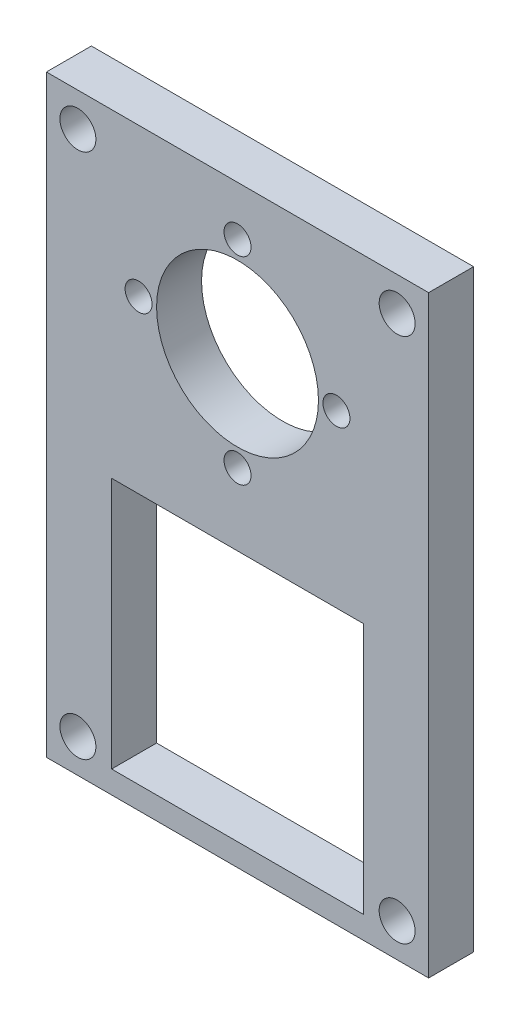
ISO-10303-21;
HEADER;
FILE_DESCRIPTION(('STEP AP214'),'2;1');
FILE_NAME('part.step','',(''),(''),'','','');
FILE_SCHEMA(('AUTOMOTIVE_DESIGN { 1 0 10303 214 1 1 1 1 }'));
ENDSEC;
DATA;
#1=APPLICATION_CONTEXT('core data for automotive mechanical design processes');
#2=APPLICATION_PROTOCOL_DEFINITION('international standard','automotive_design',2000,#1);
#3=PRODUCT_CONTEXT('',#1,'mechanical');
#4=PRODUCT('Part','Part','',(#3));
#5=PRODUCT_RELATED_PRODUCT_CATEGORY('part','',(#4));
#6=PRODUCT_DEFINITION_FORMATION('','',#4);
#7=PRODUCT_DEFINITION_CONTEXT('part definition',#1,'design');
#8=PRODUCT_DEFINITION('design','',#6,#7);
#9=PRODUCT_DEFINITION_SHAPE('','',#8);
#10=(LENGTH_UNIT() NAMED_UNIT(*) SI_UNIT(.MILLI.,.METRE.));
#11=(NAMED_UNIT(*) PLANE_ANGLE_UNIT() SI_UNIT($,.RADIAN.));
#12=(NAMED_UNIT(*) SI_UNIT($,.STERADIAN.) SOLID_ANGLE_UNIT());
#13=UNCERTAINTY_MEASURE_WITH_UNIT(LENGTH_MEASURE(1.E-05),#10,'distance_accuracy_value','');
#14=(GEOMETRIC_REPRESENTATION_CONTEXT(3) GLOBAL_UNCERTAINTY_ASSIGNED_CONTEXT((#13)) GLOBAL_UNIT_ASSIGNED_CONTEXT((#10,
#11,#12)) REPRESENTATION_CONTEXT('',''));
#15=CARTESIAN_POINT('',(0.,0.,0.));
#16=DIRECTION('',(0.,0.,1.));
#17=DIRECTION('',(1.,0.,0.));
#18=AXIS2_PLACEMENT_3D('',#15,#16,#17);
#19=CARTESIAN_POINT('',(21.25,33.,5.));
#20=DIRECTION('',(-1.,0.,0.));
#21=DIRECTION('',(0.,-1.,0.));
#22=AXIS2_PLACEMENT_3D('',#19,#20,#21);
#23=PLANE('',#22);
#24=DIRECTION('',(0.,1.,0.));
#25=VECTOR('',#24,1.);
#26=CARTESIAN_POINT('',(21.25,33.,0.));
#27=LINE('',#26,#25);
#28=CARTESIAN_POINT('',(21.25,-33.,0.));
#29=VERTEX_POINT('',#28);
#30=CARTESIAN_POINT('',(21.25,33.,0.));
#31=VERTEX_POINT('',#30);
#32=EDGE_CURVE('E169',#29,#31,#27,.T.);
#33=ORIENTED_EDGE('',*,*,#32,.T.);
#34=DIRECTION('',(0.,0.,-1.));
#35=VECTOR('',#34,1.);
#36=CARTESIAN_POINT('',(21.25,33.,5.));
#37=LINE('',#36,#35);
#38=CARTESIAN_POINT('',(21.25,33.,5.));
#39=VERTEX_POINT('',#38);
#40=EDGE_CURVE('E11',#39,#31,#37,.T.);
#41=ORIENTED_EDGE('',*,*,#40,.F.);
#42=DIRECTION('',(0.,1.,0.));
#43=VECTOR('',#42,1.);
#44=CARTESIAN_POINT('',(21.25,33.,5.));
#45=LINE('',#44,#43);
#46=CARTESIAN_POINT('',(21.25,-33.,5.));
#47=VERTEX_POINT('',#46);
#48=EDGE_CURVE('E172',#47,#39,#45,.T.);
#49=ORIENTED_EDGE('',*,*,#48,.F.);
#50=DIRECTION('',(0.,0.,-1.));
#51=VECTOR('',#50,1.);
#52=CARTESIAN_POINT('',(21.25,-33.,5.));
#53=LINE('',#52,#51);
#54=EDGE_CURVE('E182',#47,#29,#53,.T.);
#55=ORIENTED_EDGE('',*,*,#54,.T.);
#56=EDGE_LOOP('',(#33,#41,#49,#55));
#57=FACE_BOUND('',#56,.T.);
#58=ADVANCED_FACE('F37',(#57),#23,.F.);
#59=CARTESIAN_POINT('',(-21.25,33.,5.));
#60=DIRECTION('',(0.,-1.,0.));
#61=DIRECTION('',(0.,0.,-1.));
#62=AXIS2_PLACEMENT_3D('',#59,#60,#61);
#63=PLANE('',#62);
#64=DIRECTION('',(-1.,0.,0.));
#65=VECTOR('',#64,1.);
#66=CARTESIAN_POINT('',(-21.25,33.,0.));
#67=LINE('',#66,#65);
#68=CARTESIAN_POINT('',(-21.25,33.,0.));
#69=VERTEX_POINT('',#68);
#70=EDGE_CURVE('E185',#31,#69,#67,.T.);
#71=ORIENTED_EDGE('',*,*,#70,.T.);
#72=DIRECTION('',(0.,0.,-1.));
#73=VECTOR('',#72,1.);
#74=CARTESIAN_POINT('',(-21.25,33.,5.));
#75=LINE('',#74,#73);
#76=CARTESIAN_POINT('',(-21.25,33.,5.));
#77=VERTEX_POINT('',#76);
#78=EDGE_CURVE('E44',#77,#69,#75,.T.);
#79=ORIENTED_EDGE('',*,*,#78,.F.);
#80=DIRECTION('',(-1.,0.,0.));
#81=VECTOR('',#80,1.);
#82=CARTESIAN_POINT('',(-21.25,33.,5.));
#83=LINE('',#82,#81);
#84=EDGE_CURVE('E175',#39,#77,#83,.T.);
#85=ORIENTED_EDGE('',*,*,#84,.F.);
#86=ORIENTED_EDGE('',*,*,#40,.T.);
#87=EDGE_LOOP('',(#71,#79,#85,#86));
#88=FACE_BOUND('',#87,.T.);
#89=ADVANCED_FACE('F214',(#88),#63,.F.);
#90=CARTESIAN_POINT('',(-21.25,33.,5.));
#91=DIRECTION('',(1.,0.,0.));
#92=DIRECTION('',(0.,1.,0.));
#93=AXIS2_PLACEMENT_3D('',#90,#91,#92);
#94=PLANE('',#93);
#95=DIRECTION('',(0.,-1.,0.));
#96=VECTOR('',#95,1.);
#97=CARTESIAN_POINT('',(-21.25,33.,0.));
#98=LINE('',#97,#96);
#99=CARTESIAN_POINT('',(-21.25,-33.,0.));
#100=VERTEX_POINT('',#99);
#101=EDGE_CURVE('E187',#69,#100,#98,.T.);
#102=ORIENTED_EDGE('',*,*,#101,.T.);
#103=DIRECTION('',(0.,0.,-1.));
#104=VECTOR('',#103,1.);
#105=CARTESIAN_POINT('',(-21.25,-33.,5.));
#106=LINE('',#105,#104);
#107=CARTESIAN_POINT('',(-21.25,-33.,5.));
#108=VERTEX_POINT('',#107);
#109=EDGE_CURVE('E192',#108,#100,#106,.T.);
#110=ORIENTED_EDGE('',*,*,#109,.F.);
#111=DIRECTION('',(0.,-1.,0.));
#112=VECTOR('',#111,1.);
#113=CARTESIAN_POINT('',(-21.25,33.,5.));
#114=LINE('',#113,#112);
#115=EDGE_CURVE('E178',#77,#108,#114,.T.);
#116=ORIENTED_EDGE('',*,*,#115,.F.);
#117=ORIENTED_EDGE('',*,*,#78,.T.);
#118=EDGE_LOOP('',(#102,#110,#116,#117));
#119=FACE_BOUND('',#118,.T.);
#120=ADVANCED_FACE('F199',(#119),#94,.F.);
#121=CARTESIAN_POINT('',(-21.25,-33.,5.));
#122=DIRECTION('',(0.,1.,0.));
#123=DIRECTION('',(0.,0.,1.));
#124=AXIS2_PLACEMENT_3D('',#121,#122,#123);
#125=PLANE('',#124);
#126=DIRECTION('',(1.,0.,0.));
#127=VECTOR('',#126,1.);
#128=CARTESIAN_POINT('',(-21.25,-33.,0.));
#129=LINE('',#128,#127);
#130=EDGE_CURVE('E176',#100,#29,#129,.T.);
#131=ORIENTED_EDGE('',*,*,#130,.T.);
#132=ORIENTED_EDGE('',*,*,#54,.F.);
#133=DIRECTION('',(1.,0.,0.));
#134=VECTOR('',#133,1.);
#135=CARTESIAN_POINT('',(-21.25,-33.,5.));
#136=LINE('',#135,#134);
#137=EDGE_CURVE('E180',#108,#47,#136,.T.);
#138=ORIENTED_EDGE('',*,*,#137,.F.);
#139=ORIENTED_EDGE('',*,*,#109,.T.);
#140=EDGE_LOOP('',(#131,#132,#138,#139));
#141=FACE_BOUND('',#140,.T.);
#142=ADVANCED_FACE('F207',(#141),#125,.F.);
#143=CARTESIAN_POINT('',(0.,0.,5.));
#144=DIRECTION('',(0.,0.,1.));
#145=DIRECTION('',(1.,0.,0.));
#146=AXIS2_PLACEMENT_3D('',#143,#144,#145);
#147=PLANE('',#146);
#148=CARTESIAN_POINT('',(17.75,29.25,5.));
#149=DIRECTION('',(0.,0.,1.));
#150=DIRECTION('',(1.,0.,0.));
#151=AXIS2_PLACEMENT_3D('',#148,#149,#150);
#152=CIRCLE('',#151,2.);
#153=CARTESIAN_POINT('',(19.75,29.25,5.));
#154=VERTEX_POINT('',#153);
#155=EDGE_CURVE('E293',#154,#154,#152,.T.);
#156=ORIENTED_EDGE('',*,*,#155,.F.);
#157=EDGE_LOOP('',(#156));
#158=FACE_BOUND('',#157,.T.);
#159=CARTESIAN_POINT('',(-17.75,-29.25,5.));
#160=DIRECTION('',(0.,0.,1.));
#161=DIRECTION('',(1.,0.,0.));
#162=AXIS2_PLACEMENT_3D('',#159,#160,#161);
#163=CIRCLE('',#162,2.);
#164=CARTESIAN_POINT('',(-15.75,-29.25,5.));
#165=VERTEX_POINT('',#164);
#166=EDGE_CURVE('E289',#165,#165,#163,.T.);
#167=ORIENTED_EDGE('',*,*,#166,.F.);
#168=EDGE_LOOP('',(#167));
#169=FACE_BOUND('',#168,.T.);
#170=CARTESIAN_POINT('',(17.75,-29.25,5.));
#171=DIRECTION('',(0.,0.,1.));
#172=DIRECTION('',(1.,0.,0.));
#173=AXIS2_PLACEMENT_3D('',#170,#171,#172);
#174=CIRCLE('',#173,2.00000000000001);
#175=CARTESIAN_POINT('',(19.75,-29.25,5.));
#176=VERTEX_POINT('',#175);
#177=EDGE_CURVE('E284',#176,#176,#174,.T.);
#178=ORIENTED_EDGE('',*,*,#177,.F.);
#179=EDGE_LOOP('',(#178));
#180=FACE_BOUND('',#179,.T.);
#181=CARTESIAN_POINT('',(-17.75,29.25,5.));
#182=DIRECTION('',(0.,0.,1.));
#183=DIRECTION('',(1.,0.,0.));
#184=AXIS2_PLACEMENT_3D('',#181,#182,#183);
#185=CIRCLE('',#184,2.);
#186=CARTESIAN_POINT('',(-15.75,29.25,5.));
#187=VERTEX_POINT('',#186);
#188=EDGE_CURVE('E125',#187,#187,#185,.T.);
#189=ORIENTED_EDGE('',*,*,#188,.F.);
#190=EDGE_LOOP('',(#189));
#191=FACE_BOUND('',#190,.T.);
#192=DIRECTION('',(0.,1.,0.));
#193=VECTOR('',#192,1.);
#194=CARTESIAN_POINT('',(14.,-2.5,5.));
#195=LINE('',#194,#193);
#196=CARTESIAN_POINT('',(14.,-30.5,5.));
#197=VERTEX_POINT('',#196);
#198=CARTESIAN_POINT('',(14.,-2.5,5.));
#199=VERTEX_POINT('',#198);
#200=EDGE_CURVE('E51',#197,#199,#195,.T.);
#201=ORIENTED_EDGE('',*,*,#200,.F.);
#202=DIRECTION('',(1.,0.,0.));
#203=VECTOR('',#202,1.);
#204=CARTESIAN_POINT('',(-14.,-30.5,5.));
#205=LINE('',#204,#203);
#206=CARTESIAN_POINT('',(-14.,-30.5,5.));
#207=VERTEX_POINT('',#206);
#208=EDGE_CURVE('E119',#207,#197,#205,.T.);
#209=ORIENTED_EDGE('',*,*,#208,.F.);
#210=DIRECTION('',(0.,-1.,0.));
#211=VECTOR('',#210,1.);
#212=CARTESIAN_POINT('',(-14.,-2.5,5.));
#213=LINE('',#212,#211);
#214=CARTESIAN_POINT('',(-14.,-2.5,5.));
#215=VERTEX_POINT('',#214);
#216=EDGE_CURVE('E122',#215,#207,#213,.T.);
#217=ORIENTED_EDGE('',*,*,#216,.F.);
#218=DIRECTION('',(-1.,0.,0.));
#219=VECTOR('',#218,1.);
#220=CARTESIAN_POINT('',(-14.,-2.5,5.));
#221=LINE('',#220,#219);
#222=EDGE_CURVE('E131',#199,#215,#221,.T.);
#223=ORIENTED_EDGE('',*,*,#222,.F.);
#224=EDGE_LOOP('',(#201,#209,#217,#223));
#225=FACE_BOUND('',#224,.T.);
#226=CARTESIAN_POINT('',(0.,27.5,5.));
#227=DIRECTION('',(0.,0.,1.));
#228=DIRECTION('',(1.,0.,0.));
#229=AXIS2_PLACEMENT_3D('',#226,#227,#228);
#230=CIRCLE('',#229,1.5);
#231=CARTESIAN_POINT('',(1.5,27.5,5.));
#232=VERTEX_POINT('',#231);
#233=EDGE_CURVE('E154',#232,#232,#230,.T.);
#234=ORIENTED_EDGE('',*,*,#233,.F.);
#235=EDGE_LOOP('',(#234));
#236=FACE_BOUND('',#235,.T.);
#237=CARTESIAN_POINT('',(11.,16.5,5.));
#238=DIRECTION('',(0.,0.,1.));
#239=DIRECTION('',(1.,0.,0.));
#240=AXIS2_PLACEMENT_3D('',#237,#238,#239);
#241=CIRCLE('',#240,1.5);
#242=CARTESIAN_POINT('',(12.5,16.5,5.));
#243=VERTEX_POINT('',#242);
#244=EDGE_CURVE('E161',#243,#243,#241,.T.);
#245=ORIENTED_EDGE('',*,*,#244,.F.);
#246=EDGE_LOOP('',(#245));
#247=FACE_BOUND('',#246,.T.);
#248=CARTESIAN_POINT('',(-11.,16.5,5.));
#249=DIRECTION('',(0.,0.,1.));
#250=DIRECTION('',(1.,0.,0.));
#251=AXIS2_PLACEMENT_3D('',#248,#249,#250);
#252=CIRCLE('',#251,1.5);
#253=CARTESIAN_POINT('',(-9.5,16.5,5.));
#254=VERTEX_POINT('',#253);
#255=EDGE_CURVE('E142',#254,#254,#252,.T.);
#256=ORIENTED_EDGE('',*,*,#255,.F.);
#257=EDGE_LOOP('',(#256));
#258=FACE_BOUND('',#257,.T.);
#259=CARTESIAN_POINT('',(0.,5.5,5.));
#260=DIRECTION('',(0.,0.,1.));
#261=DIRECTION('',(1.,0.,0.));
#262=AXIS2_PLACEMENT_3D('',#259,#260,#261);
#263=CIRCLE('',#262,1.5);
#264=CARTESIAN_POINT('',(1.5,5.5,5.));
#265=VERTEX_POINT('',#264);
#266=EDGE_CURVE('E149',#265,#265,#263,.T.);
#267=ORIENTED_EDGE('',*,*,#266,.F.);
#268=EDGE_LOOP('',(#267));
#269=FACE_BOUND('',#268,.T.);
#270=CARTESIAN_POINT('',(0.,16.5,5.));
#271=DIRECTION('',(0.,0.,1.));
#272=DIRECTION('',(1.,0.,0.));
#273=AXIS2_PLACEMENT_3D('',#270,#271,#272);
#274=CIRCLE('',#273,9.);
#275=CARTESIAN_POINT('',(9.,16.5,5.));
#276=VERTEX_POINT('',#275);
#277=EDGE_CURVE('E157',#276,#276,#274,.T.);
#278=ORIENTED_EDGE('',*,*,#277,.F.);
#279=EDGE_LOOP('',(#278));
#280=FACE_BOUND('',#279,.T.);
#281=ORIENTED_EDGE('',*,*,#48,.T.);
#282=ORIENTED_EDGE('',*,*,#84,.T.);
#283=ORIENTED_EDGE('',*,*,#115,.T.);
#284=ORIENTED_EDGE('',*,*,#137,.T.);
#285=EDGE_LOOP('',(#281,#282,#283,#284));
#286=FACE_BOUND('',#285,.T.);
#287=ADVANCED_FACE('F213',(#158,#169,#180,#191,#225,#236,#247,#258,#269,#280,#286),#147,.T.);
#288=CARTESIAN_POINT('',(0.,0.,0.));
#289=DIRECTION('',(0.,0.,1.));
#290=DIRECTION('',(1.,0.,0.));
#291=AXIS2_PLACEMENT_3D('',#288,#289,#290);
#292=PLANE('',#291);
#293=CARTESIAN_POINT('',(17.75,29.25,0.));
#294=DIRECTION('',(0.,0.,1.));
#295=DIRECTION('',(1.,0.,0.));
#296=AXIS2_PLACEMENT_3D('',#293,#294,#295);
#297=CIRCLE('',#296,2.);
#298=CARTESIAN_POINT('',(19.75,29.25,0.));
#299=VERTEX_POINT('',#298);
#300=EDGE_CURVE('E296',#299,#299,#297,.T.);
#301=ORIENTED_EDGE('',*,*,#300,.T.);
#302=EDGE_LOOP('',(#301));
#303=FACE_BOUND('',#302,.T.);
#304=CARTESIAN_POINT('',(-17.75,-29.25,0.));
#305=DIRECTION('',(0.,0.,1.));
#306=DIRECTION('',(1.,0.,0.));
#307=AXIS2_PLACEMENT_3D('',#304,#305,#306);
#308=CIRCLE('',#307,2.);
#309=CARTESIAN_POINT('',(-15.75,-29.25,0.));
#310=VERTEX_POINT('',#309);
#311=EDGE_CURVE('E286',#310,#310,#308,.T.);
#312=ORIENTED_EDGE('',*,*,#311,.T.);
#313=EDGE_LOOP('',(#312));
#314=FACE_BOUND('',#313,.T.);
#315=CARTESIAN_POINT('',(17.75,-29.25,0.));
#316=DIRECTION('',(0.,0.,1.));
#317=DIRECTION('',(1.,0.,0.));
#318=AXIS2_PLACEMENT_3D('',#315,#316,#317);
#319=CIRCLE('',#318,2.00000000000001);
#320=CARTESIAN_POINT('',(19.75,-29.25,0.));
#321=VERTEX_POINT('',#320);
#322=EDGE_CURVE('E281',#321,#321,#319,.T.);
#323=ORIENTED_EDGE('',*,*,#322,.T.);
#324=EDGE_LOOP('',(#323));
#325=FACE_BOUND('',#324,.T.);
#326=CARTESIAN_POINT('',(-17.75,29.25,0.));
#327=DIRECTION('',(0.,0.,1.));
#328=DIRECTION('',(1.,0.,0.));
#329=AXIS2_PLACEMENT_3D('',#326,#327,#328);
#330=CIRCLE('',#329,2.);
#331=CARTESIAN_POINT('',(-15.75,29.25,0.));
#332=VERTEX_POINT('',#331);
#333=EDGE_CURVE('E132',#332,#332,#330,.T.);
#334=ORIENTED_EDGE('',*,*,#333,.T.);
#335=EDGE_LOOP('',(#334));
#336=FACE_BOUND('',#335,.T.);
#337=DIRECTION('',(1.,0.,0.));
#338=VECTOR('',#337,1.);
#339=CARTESIAN_POINT('',(-14.,-30.5,0.));
#340=LINE('',#339,#338);
#341=CARTESIAN_POINT('',(-14.,-30.5,0.));
#342=VERTEX_POINT('',#341);
#343=CARTESIAN_POINT('',(14.,-30.5,0.));
#344=VERTEX_POINT('',#343);
#345=EDGE_CURVE('E109',#342,#344,#340,.T.);
#346=ORIENTED_EDGE('',*,*,#345,.T.);
#347=DIRECTION('',(0.,1.,0.));
#348=VECTOR('',#347,1.);
#349=CARTESIAN_POINT('',(14.,-2.5,0.));
#350=LINE('',#349,#348);
#351=CARTESIAN_POINT('',(14.,-2.5,0.));
#352=VERTEX_POINT('',#351);
#353=EDGE_CURVE('E103',#344,#352,#350,.T.);
#354=ORIENTED_EDGE('',*,*,#353,.T.);
#355=DIRECTION('',(-1.,0.,0.));
#356=VECTOR('',#355,1.);
#357=CARTESIAN_POINT('',(-14.,-2.5,0.));
#358=LINE('',#357,#356);
#359=CARTESIAN_POINT('',(-14.,-2.5,0.));
#360=VERTEX_POINT('',#359);
#361=EDGE_CURVE('E112',#352,#360,#358,.T.);
#362=ORIENTED_EDGE('',*,*,#361,.T.);
#363=DIRECTION('',(0.,-1.,0.));
#364=VECTOR('',#363,1.);
#365=CARTESIAN_POINT('',(-14.,-2.5,0.));
#366=LINE('',#365,#364);
#367=EDGE_CURVE('E59',#360,#342,#366,.T.);
#368=ORIENTED_EDGE('',*,*,#367,.T.);
#369=EDGE_LOOP('',(#346,#354,#362,#368));
#370=FACE_BOUND('',#369,.T.);
#371=CARTESIAN_POINT('',(0.,27.5,0.));
#372=DIRECTION('',(0.,0.,1.));
#373=DIRECTION('',(1.,0.,0.));
#374=AXIS2_PLACEMENT_3D('',#371,#372,#373);
#375=CIRCLE('',#374,1.5);
#376=CARTESIAN_POINT('',(1.5,27.5,0.));
#377=VERTEX_POINT('',#376);
#378=EDGE_CURVE('E158',#377,#377,#375,.T.);
#379=ORIENTED_EDGE('',*,*,#378,.T.);
#380=EDGE_LOOP('',(#379));
#381=FACE_BOUND('',#380,.T.);
#382=CARTESIAN_POINT('',(11.,16.5,0.));
#383=DIRECTION('',(0.,0.,1.));
#384=DIRECTION('',(1.,0.,0.));
#385=AXIS2_PLACEMENT_3D('',#382,#383,#384);
#386=CIRCLE('',#385,1.5);
#387=CARTESIAN_POINT('',(12.5,16.5,0.));
#388=VERTEX_POINT('',#387);
#389=EDGE_CURVE('E145',#388,#388,#386,.T.);
#390=ORIENTED_EDGE('',*,*,#389,.T.);
#391=EDGE_LOOP('',(#390));
#392=FACE_BOUND('',#391,.T.);
#393=CARTESIAN_POINT('',(-11.,16.5,0.));
#394=DIRECTION('',(0.,0.,1.));
#395=DIRECTION('',(1.,0.,0.));
#396=AXIS2_PLACEMENT_3D('',#393,#394,#395);
#397=CIRCLE('',#396,1.5);
#398=CARTESIAN_POINT('',(-9.5,16.5,0.));
#399=VERTEX_POINT('',#398);
#400=EDGE_CURVE('E146',#399,#399,#397,.T.);
#401=ORIENTED_EDGE('',*,*,#400,.T.);
#402=EDGE_LOOP('',(#401));
#403=FACE_BOUND('',#402,.T.);
#404=CARTESIAN_POINT('',(0.,5.5,0.));
#405=DIRECTION('',(0.,0.,1.));
#406=DIRECTION('',(1.,0.,0.));
#407=AXIS2_PLACEMENT_3D('',#404,#405,#406);
#408=CIRCLE('',#407,1.5);
#409=CARTESIAN_POINT('',(1.5,5.5,0.));
#410=VERTEX_POINT('',#409);
#411=EDGE_CURVE('E138',#410,#410,#408,.T.);
#412=ORIENTED_EDGE('',*,*,#411,.T.);
#413=EDGE_LOOP('',(#412));
#414=FACE_BOUND('',#413,.T.);
#415=CARTESIAN_POINT('',(0.,16.5,0.));
#416=DIRECTION('',(0.,0.,1.));
#417=DIRECTION('',(1.,0.,0.));
#418=AXIS2_PLACEMENT_3D('',#415,#416,#417);
#419=CIRCLE('',#418,9.);
#420=CARTESIAN_POINT('',(9.,16.5,0.));
#421=VERTEX_POINT('',#420);
#422=EDGE_CURVE('E166',#421,#421,#419,.T.);
#423=ORIENTED_EDGE('',*,*,#422,.T.);
#424=EDGE_LOOP('',(#423));
#425=FACE_BOUND('',#424,.T.);
#426=ORIENTED_EDGE('',*,*,#32,.F.);
#427=ORIENTED_EDGE('',*,*,#130,.F.);
#428=ORIENTED_EDGE('',*,*,#101,.F.);
#429=ORIENTED_EDGE('',*,*,#70,.F.);
#430=EDGE_LOOP('',(#426,#427,#428,#429));
#431=FACE_BOUND('',#430,.T.);
#432=ADVANCED_FACE('F116',(#303,#314,#325,#336,#370,#381,#392,#403,#414,#425,#431),#292,.F.);
#433=CARTESIAN_POINT('',(0.,16.5,0.));
#434=DIRECTION('',(0.,0.,1.));
#435=DIRECTION('',(1.,0.,0.));
#436=AXIS2_PLACEMENT_3D('',#433,#434,#435);
#437=CYLINDRICAL_SURFACE('',#436,9.);
#438=ORIENTED_EDGE('',*,*,#422,.F.);
#439=EDGE_LOOP('',(#438));
#440=FACE_BOUND('',#439,.T.);
#441=ORIENTED_EDGE('',*,*,#277,.T.);
#442=EDGE_LOOP('',(#441));
#443=FACE_BOUND('',#442,.T.);
#444=ADVANCED_FACE('F226',(#440,#443),#437,.F.);
#445=CARTESIAN_POINT('',(0.,5.5,0.));
#446=DIRECTION('',(0.,0.,1.));
#447=DIRECTION('',(1.,0.,0.));
#448=AXIS2_PLACEMENT_3D('',#445,#446,#447);
#449=CYLINDRICAL_SURFACE('',#448,1.5);
#450=ORIENTED_EDGE('',*,*,#411,.F.);
#451=EDGE_LOOP('',(#450));
#452=FACE_BOUND('',#451,.T.);
#453=ORIENTED_EDGE('',*,*,#266,.T.);
#454=EDGE_LOOP('',(#453));
#455=FACE_BOUND('',#454,.T.);
#456=ADVANCED_FACE('F233',(#452,#455),#449,.F.);
#457=CARTESIAN_POINT('',(-11.,16.5,0.));
#458=DIRECTION('',(0.,0.,1.));
#459=DIRECTION('',(1.,0.,0.));
#460=AXIS2_PLACEMENT_3D('',#457,#458,#459);
#461=CYLINDRICAL_SURFACE('',#460,1.5);
#462=ORIENTED_EDGE('',*,*,#400,.F.);
#463=EDGE_LOOP('',(#462));
#464=FACE_BOUND('',#463,.T.);
#465=ORIENTED_EDGE('',*,*,#255,.T.);
#466=EDGE_LOOP('',(#465));
#467=FACE_BOUND('',#466,.T.);
#468=ADVANCED_FACE('F239',(#464,#467),#461,.F.);
#469=CARTESIAN_POINT('',(11.,16.5,0.));
#470=DIRECTION('',(0.,0.,1.));
#471=DIRECTION('',(1.,0.,0.));
#472=AXIS2_PLACEMENT_3D('',#469,#470,#471);
#473=CYLINDRICAL_SURFACE('',#472,1.5);
#474=ORIENTED_EDGE('',*,*,#389,.F.);
#475=EDGE_LOOP('',(#474));
#476=FACE_BOUND('',#475,.T.);
#477=ORIENTED_EDGE('',*,*,#244,.T.);
#478=EDGE_LOOP('',(#477));
#479=FACE_BOUND('',#478,.T.);
#480=ADVANCED_FACE('F235',(#476,#479),#473,.F.);
#481=CARTESIAN_POINT('',(0.,27.5,0.));
#482=DIRECTION('',(0.,0.,1.));
#483=DIRECTION('',(1.,0.,0.));
#484=AXIS2_PLACEMENT_3D('',#481,#482,#483);
#485=CYLINDRICAL_SURFACE('',#484,1.5);
#486=ORIENTED_EDGE('',*,*,#378,.F.);
#487=EDGE_LOOP('',(#486));
#488=FACE_BOUND('',#487,.T.);
#489=ORIENTED_EDGE('',*,*,#233,.T.);
#490=EDGE_LOOP('',(#489));
#491=FACE_BOUND('',#490,.T.);
#492=ADVANCED_FACE('F238',(#488,#491),#485,.F.);
#493=CARTESIAN_POINT('',(14.,-2.5,0.));
#494=DIRECTION('',(1.,0.,0.));
#495=DIRECTION('',(0.,1.,0.));
#496=AXIS2_PLACEMENT_3D('',#493,#494,#495);
#497=PLANE('',#496);
#498=ORIENTED_EDGE('',*,*,#200,.T.);
#499=DIRECTION('',(0.,0.,1.));
#500=VECTOR('',#499,1.);
#501=CARTESIAN_POINT('',(14.,-2.5,0.));
#502=LINE('',#501,#500);
#503=EDGE_CURVE('E99',#352,#199,#502,.T.);
#504=ORIENTED_EDGE('',*,*,#503,.F.);
#505=ORIENTED_EDGE('',*,*,#353,.F.);
#506=DIRECTION('',(0.,0.,1.));
#507=VECTOR('',#506,1.);
#508=CARTESIAN_POINT('',(14.,-30.5,0.));
#509=LINE('',#508,#507);
#510=EDGE_CURVE('E136',#344,#197,#509,.T.);
#511=ORIENTED_EDGE('',*,*,#510,.T.);
#512=EDGE_LOOP('',(#498,#504,#505,#511));
#513=FACE_BOUND('',#512,.T.);
#514=ADVANCED_FACE('F101',(#513),#497,.F.);
#515=CARTESIAN_POINT('',(-14.,-30.5,0.));
#516=DIRECTION('',(0.,-1.,0.));
#517=DIRECTION('',(0.,0.,-1.));
#518=AXIS2_PLACEMENT_3D('',#515,#516,#517);
#519=PLANE('',#518);
#520=ORIENTED_EDGE('',*,*,#208,.T.);
#521=ORIENTED_EDGE('',*,*,#510,.F.);
#522=ORIENTED_EDGE('',*,*,#345,.F.);
#523=DIRECTION('',(0.,0.,1.));
#524=VECTOR('',#523,1.);
#525=CARTESIAN_POINT('',(-14.,-30.5,0.));
#526=LINE('',#525,#524);
#527=EDGE_CURVE('E139',#342,#207,#526,.T.);
#528=ORIENTED_EDGE('',*,*,#527,.T.);
#529=EDGE_LOOP('',(#520,#521,#522,#528));
#530=FACE_BOUND('',#529,.T.);
#531=ADVANCED_FACE('F252',(#530),#519,.F.);
#532=CARTESIAN_POINT('',(-14.,-2.5,0.));
#533=DIRECTION('',(-1.,0.,0.));
#534=DIRECTION('',(0.,-1.,0.));
#535=AXIS2_PLACEMENT_3D('',#532,#533,#534);
#536=PLANE('',#535);
#537=ORIENTED_EDGE('',*,*,#216,.T.);
#538=ORIENTED_EDGE('',*,*,#527,.F.);
#539=ORIENTED_EDGE('',*,*,#367,.F.);
#540=DIRECTION('',(0.,0.,1.));
#541=VECTOR('',#540,1.);
#542=CARTESIAN_POINT('',(-14.,-2.5,0.));
#543=LINE('',#542,#541);
#544=EDGE_CURVE('E108',#360,#215,#543,.T.);
#545=ORIENTED_EDGE('',*,*,#544,.T.);
#546=EDGE_LOOP('',(#537,#538,#539,#545));
#547=FACE_BOUND('',#546,.T.);
#548=ADVANCED_FACE('F256',(#547),#536,.F.);
#549=CARTESIAN_POINT('',(-14.,-2.5,0.));
#550=DIRECTION('',(0.,1.,0.));
#551=DIRECTION('',(0.,0.,1.));
#552=AXIS2_PLACEMENT_3D('',#549,#550,#551);
#553=PLANE('',#552);
#554=ORIENTED_EDGE('',*,*,#222,.T.);
#555=ORIENTED_EDGE('',*,*,#544,.F.);
#556=ORIENTED_EDGE('',*,*,#361,.F.);
#557=ORIENTED_EDGE('',*,*,#503,.T.);
#558=EDGE_LOOP('',(#554,#555,#556,#557));
#559=FACE_BOUND('',#558,.T.);
#560=ADVANCED_FACE('F113',(#559),#553,.F.);
#561=CARTESIAN_POINT('',(-17.75,29.25,0.));
#562=DIRECTION('',(0.,0.,1.));
#563=DIRECTION('',(1.,0.,0.));
#564=AXIS2_PLACEMENT_3D('',#561,#562,#563);
#565=CYLINDRICAL_SURFACE('',#564,2.);
#566=ORIENTED_EDGE('',*,*,#333,.F.);
#567=EDGE_LOOP('',(#566));
#568=FACE_BOUND('',#567,.T.);
#569=ORIENTED_EDGE('',*,*,#188,.T.);
#570=EDGE_LOOP('',(#569));
#571=FACE_BOUND('',#570,.T.);
#572=ADVANCED_FACE('F255',(#568,#571),#565,.F.);
#573=CARTESIAN_POINT('',(17.75,-29.25,0.));
#574=DIRECTION('',(0.,0.,1.));
#575=DIRECTION('',(1.,0.,0.));
#576=AXIS2_PLACEMENT_3D('',#573,#574,#575);
#577=CYLINDRICAL_SURFACE('',#576,2.00000000000001);
#578=ORIENTED_EDGE('',*,*,#322,.F.);
#579=EDGE_LOOP('',(#578));
#580=FACE_BOUND('',#579,.T.);
#581=ORIENTED_EDGE('',*,*,#177,.T.);
#582=EDGE_LOOP('',(#581));
#583=FACE_BOUND('',#582,.T.);
#584=ADVANCED_FACE('F264',(#580,#583),#577,.F.);
#585=CARTESIAN_POINT('',(-17.75,-29.25,0.));
#586=DIRECTION('',(0.,0.,1.));
#587=DIRECTION('',(1.,0.,0.));
#588=AXIS2_PLACEMENT_3D('',#585,#586,#587);
#589=CYLINDRICAL_SURFACE('',#588,2.);
#590=ORIENTED_EDGE('',*,*,#311,.F.);
#591=EDGE_LOOP('',(#590));
#592=FACE_BOUND('',#591,.T.);
#593=ORIENTED_EDGE('',*,*,#166,.T.);
#594=EDGE_LOOP('',(#593));
#595=FACE_BOUND('',#594,.T.);
#596=ADVANCED_FACE('F266',(#592,#595),#589,.F.);
#597=CARTESIAN_POINT('',(17.75,29.25,0.));
#598=DIRECTION('',(0.,0.,1.));
#599=DIRECTION('',(1.,0.,0.));
#600=AXIS2_PLACEMENT_3D('',#597,#598,#599);
#601=CYLINDRICAL_SURFACE('',#600,2.);
#602=ORIENTED_EDGE('',*,*,#300,.F.);
#603=EDGE_LOOP('',(#602));
#604=FACE_BOUND('',#603,.T.);
#605=ORIENTED_EDGE('',*,*,#155,.T.);
#606=EDGE_LOOP('',(#605));
#607=FACE_BOUND('',#606,.T.);
#608=ADVANCED_FACE('F269',(#604,#607),#601,.F.);
#609=CLOSED_SHELL('',(#58,#89,#120,#142,#287,#432,#444,#456,#468,#480,#492,#514,#531,#548,#560,
#572,#584,#596,#608));
#610=MANIFOLD_SOLID_BREP('B2',#609);
#611=ADVANCED_BREP_SHAPE_REPRESENTATION('',(#18,#610),#14);
#612=SHAPE_DEFINITION_REPRESENTATION(#9,#611);
ENDSEC;
END-ISO-10303-21;
